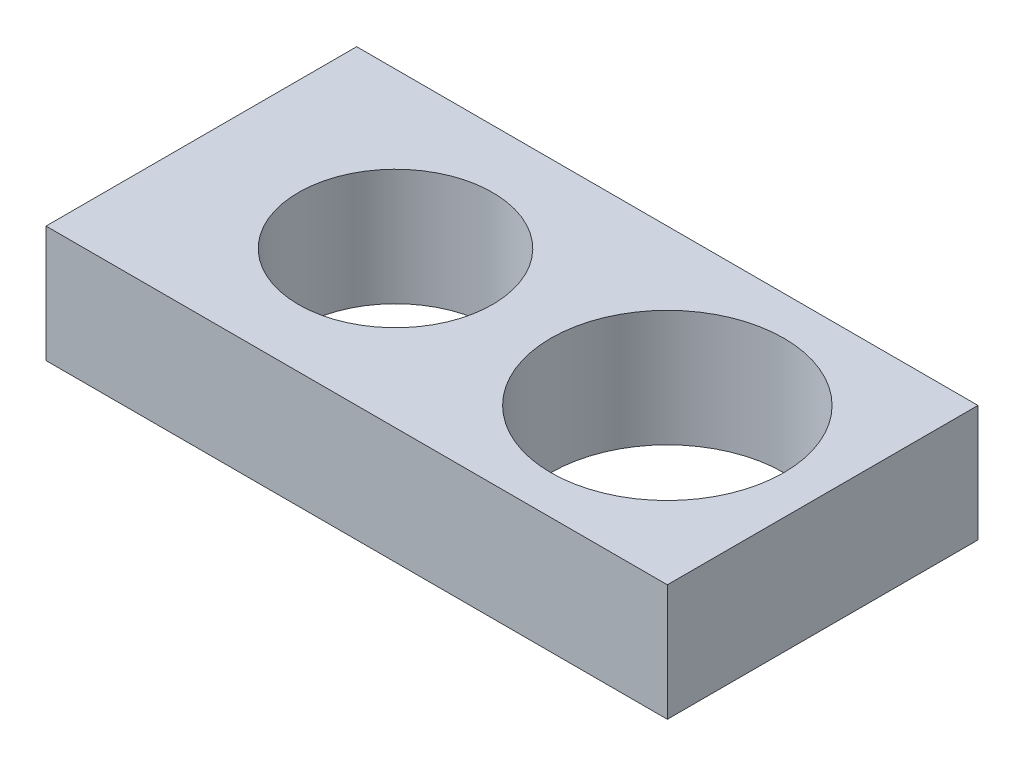
ISO-10303-21;
HEADER;
FILE_DESCRIPTION(('STEP AP214'),'2;1');
FILE_NAME('part.step','',(''),(''),'','','');
FILE_SCHEMA(('AUTOMOTIVE_DESIGN { 1 0 10303 214 1 1 1 1 }'));
ENDSEC;
DATA;
#1=APPLICATION_CONTEXT('core data for automotive mechanical design processes');
#2=APPLICATION_PROTOCOL_DEFINITION('international standard','automotive_design',2000,#1);
#3=PRODUCT_CONTEXT('',#1,'mechanical');
#4=PRODUCT('Part','Part','',(#3));
#5=PRODUCT_RELATED_PRODUCT_CATEGORY('part','',(#4));
#6=PRODUCT_DEFINITION_FORMATION('','',#4);
#7=PRODUCT_DEFINITION_CONTEXT('part definition',#1,'design');
#8=PRODUCT_DEFINITION('design','',#6,#7);
#9=PRODUCT_DEFINITION_SHAPE('','',#8);
#10=(LENGTH_UNIT() NAMED_UNIT(*) SI_UNIT(.MILLI.,.METRE.));
#11=(NAMED_UNIT(*) PLANE_ANGLE_UNIT() SI_UNIT($,.RADIAN.));
#12=(NAMED_UNIT(*) SI_UNIT($,.STERADIAN.) SOLID_ANGLE_UNIT());
#13=UNCERTAINTY_MEASURE_WITH_UNIT(LENGTH_MEASURE(1.E-05),#10,'distance_accuracy_value','');
#14=(GEOMETRIC_REPRESENTATION_CONTEXT(3) GLOBAL_UNCERTAINTY_ASSIGNED_CONTEXT((#13)) GLOBAL_UNIT_ASSIGNED_CONTEXT((#10,
#11,#12)) REPRESENTATION_CONTEXT('',''));
#15=CARTESIAN_POINT('',(0.,0.,0.));
#16=DIRECTION('',(0.,0.,1.));
#17=DIRECTION('',(1.,0.,0.));
#18=AXIS2_PLACEMENT_3D('',#15,#16,#17);
#19=CARTESIAN_POINT('',(0.,15.,0.));
#20=DIRECTION('',(0.,-1.,0.));
#21=DIRECTION('',(0.,0.,-1.));
#22=AXIS2_PLACEMENT_3D('',#19,#20,#21);
#23=PLANE('',#22);
#24=DIRECTION('',(0.,0.,-1.));
#25=VECTOR('',#24,1.);
#26=CARTESIAN_POINT('',(40.,15.,20.));
#27=LINE('',#26,#25);
#28=CARTESIAN_POINT('',(40.,15.,20.));
#29=VERTEX_POINT('',#28);
#30=CARTESIAN_POINT('',(40.,15.,-20.));
#31=VERTEX_POINT('',#30);
#32=EDGE_CURVE('E96',#29,#31,#27,.T.);
#33=ORIENTED_EDGE('',*,*,#32,.T.);
#34=DIRECTION('',(-1.,0.,0.));
#35=VECTOR('',#34,1.);
#36=CARTESIAN_POINT('',(-40.,15.,-20.));
#37=LINE('',#36,#35);
#38=CARTESIAN_POINT('',(-40.,15.,-20.));
#39=VERTEX_POINT('',#38);
#40=EDGE_CURVE('E91',#31,#39,#37,.T.);
#41=ORIENTED_EDGE('',*,*,#40,.T.);
#42=DIRECTION('',(0.,0.,1.));
#43=VECTOR('',#42,1.);
#44=CARTESIAN_POINT('',(-40.,15.,20.));
#45=LINE('',#44,#43);
#46=CARTESIAN_POINT('',(-40.,15.,20.));
#47=VERTEX_POINT('',#46);
#48=EDGE_CURVE('E94',#39,#47,#45,.T.);
#49=ORIENTED_EDGE('',*,*,#48,.T.);
#50=DIRECTION('',(1.,0.,0.));
#51=VECTOR('',#50,1.);
#52=CARTESIAN_POINT('',(-40.,15.,20.));
#53=LINE('',#52,#51);
#54=EDGE_CURVE('E61',#47,#29,#53,.T.);
#55=ORIENTED_EDGE('',*,*,#54,.T.);
#56=EDGE_LOOP('',(#33,#41,#49,#55));
#57=FACE_BOUND('',#56,.T.);
#58=CARTESIAN_POINT('',(-15.,15.,0.));
#59=DIRECTION('',(0.,1.,0.));
#60=DIRECTION('',(0.,0.,1.));
#61=AXIS2_PLACEMENT_3D('',#58,#59,#60);
#62=CIRCLE('',#61,12.5);
#63=CARTESIAN_POINT('',(-15.,15.,12.5));
#64=VERTEX_POINT('',#63);
#65=EDGE_CURVE('E116',#64,#64,#62,.T.);
#66=ORIENTED_EDGE('',*,*,#65,.F.);
#67=EDGE_LOOP('',(#66));
#68=FACE_BOUND('',#67,.T.);
#69=CARTESIAN_POINT('',(20.,15.,0.));
#70=DIRECTION('',(0.,1.,0.));
#71=DIRECTION('',(0.,0.,1.));
#72=AXIS2_PLACEMENT_3D('',#69,#70,#71);
#73=CIRCLE('',#72,15.);
#74=CARTESIAN_POINT('',(20.,15.,15.));
#75=VERTEX_POINT('',#74);
#76=EDGE_CURVE('E138',#75,#75,#73,.T.);
#77=ORIENTED_EDGE('',*,*,#76,.F.);
#78=EDGE_LOOP('',(#77));
#79=FACE_BOUND('',#78,.T.);
#80=ADVANCED_FACE('F43',(#57,#68,#79),#23,.F.);
#81=CARTESIAN_POINT('',(0.,0.,0.));
#82=DIRECTION('',(0.,-1.,0.));
#83=DIRECTION('',(0.,0.,-1.));
#84=AXIS2_PLACEMENT_3D('',#81,#82,#83);
#85=PLANE('',#84);
#86=CARTESIAN_POINT('',(-15.,0.,0.));
#87=DIRECTION('',(0.,1.,0.));
#88=DIRECTION('',(0.,0.,1.));
#89=AXIS2_PLACEMENT_3D('',#86,#87,#88);
#90=CIRCLE('',#89,12.5);
#91=CARTESIAN_POINT('',(-15.,0.,12.5));
#92=VERTEX_POINT('',#91);
#93=EDGE_CURVE('E134',#92,#92,#90,.T.);
#94=ORIENTED_EDGE('',*,*,#93,.T.);
#95=EDGE_LOOP('',(#94));
#96=FACE_BOUND('',#95,.T.);
#97=DIRECTION('',(0.,0.,-1.));
#98=VECTOR('',#97,1.);
#99=CARTESIAN_POINT('',(40.,0.,20.));
#100=LINE('',#99,#98);
#101=CARTESIAN_POINT('',(40.,0.,20.));
#102=VERTEX_POINT('',#101);
#103=CARTESIAN_POINT('',(40.,0.,-20.));
#104=VERTEX_POINT('',#103);
#105=EDGE_CURVE('E112',#102,#104,#100,.T.);
#106=ORIENTED_EDGE('',*,*,#105,.F.);
#107=DIRECTION('',(1.,0.,0.));
#108=VECTOR('',#107,1.);
#109=CARTESIAN_POINT('',(-40.,0.,20.));
#110=LINE('',#109,#108);
#111=CARTESIAN_POINT('',(-40.,0.,20.));
#112=VERTEX_POINT('',#111);
#113=EDGE_CURVE('E84',#112,#102,#110,.T.);
#114=ORIENTED_EDGE('',*,*,#113,.F.);
#115=DIRECTION('',(0.,0.,1.));
#116=VECTOR('',#115,1.);
#117=CARTESIAN_POINT('',(-40.,0.,20.));
#118=LINE('',#117,#116);
#119=CARTESIAN_POINT('',(-40.,0.,-20.));
#120=VERTEX_POINT('',#119);
#121=EDGE_CURVE('E78',#120,#112,#118,.T.);
#122=ORIENTED_EDGE('',*,*,#121,.F.);
#123=DIRECTION('',(-1.,0.,0.));
#124=VECTOR('',#123,1.);
#125=CARTESIAN_POINT('',(-40.,0.,-20.));
#126=LINE('',#125,#124);
#127=EDGE_CURVE('E101',#104,#120,#126,.T.);
#128=ORIENTED_EDGE('',*,*,#127,.F.);
#129=EDGE_LOOP('',(#106,#114,#122,#128));
#130=FACE_BOUND('',#129,.T.);
#131=CARTESIAN_POINT('',(20.,0.,0.));
#132=DIRECTION('',(0.,1.,0.));
#133=DIRECTION('',(0.,0.,1.));
#134=AXIS2_PLACEMENT_3D('',#131,#132,#133);
#135=CIRCLE('',#134,15.);
#136=CARTESIAN_POINT('',(20.,0.,15.));
#137=VERTEX_POINT('',#136);
#138=EDGE_CURVE('E142',#137,#137,#135,.T.);
#139=ORIENTED_EDGE('',*,*,#138,.T.);
#140=EDGE_LOOP('',(#139));
#141=FACE_BOUND('',#140,.T.);
#142=ADVANCED_FACE('F129',(#96,#130,#141),#85,.T.);
#143=CARTESIAN_POINT('',(40.,15.,20.));
#144=DIRECTION('',(-1.,0.,0.));
#145=DIRECTION('',(0.,0.,1.));
#146=AXIS2_PLACEMENT_3D('',#143,#144,#145);
#147=PLANE('',#146);
#148=ORIENTED_EDGE('',*,*,#105,.T.);
#149=DIRECTION('',(0.,-1.,0.));
#150=VECTOR('',#149,1.);
#151=CARTESIAN_POINT('',(40.,15.,-20.));
#152=LINE('',#151,#150);
#153=EDGE_CURVE('E11',#31,#104,#152,.T.);
#154=ORIENTED_EDGE('',*,*,#153,.F.);
#155=ORIENTED_EDGE('',*,*,#32,.F.);
#156=DIRECTION('',(0.,-1.,0.));
#157=VECTOR('',#156,1.);
#158=CARTESIAN_POINT('',(40.,15.,20.));
#159=LINE('',#158,#157);
#160=EDGE_CURVE('E108',#29,#102,#159,.T.);
#161=ORIENTED_EDGE('',*,*,#160,.T.);
#162=EDGE_LOOP('',(#148,#154,#155,#161));
#163=FACE_BOUND('',#162,.T.);
#164=ADVANCED_FACE('F45',(#163),#147,.F.);
#165=CARTESIAN_POINT('',(-40.,15.,-20.));
#166=DIRECTION('',(0.,0.,1.));
#167=DIRECTION('',(1.,0.,0.));
#168=AXIS2_PLACEMENT_3D('',#165,#166,#167);
#169=PLANE('',#168);
#170=ORIENTED_EDGE('',*,*,#127,.T.);
#171=DIRECTION('',(0.,-1.,0.));
#172=VECTOR('',#171,1.);
#173=CARTESIAN_POINT('',(-40.,15.,-20.));
#174=LINE('',#173,#172);
#175=EDGE_CURVE('E53',#39,#120,#174,.T.);
#176=ORIENTED_EDGE('',*,*,#175,.F.);
#177=ORIENTED_EDGE('',*,*,#40,.F.);
#178=ORIENTED_EDGE('',*,*,#153,.T.);
#179=EDGE_LOOP('',(#170,#176,#177,#178));
#180=FACE_BOUND('',#179,.T.);
#181=ADVANCED_FACE('F100',(#180),#169,.F.);
#182=CARTESIAN_POINT('',(-40.,15.,20.));
#183=DIRECTION('',(1.,0.,0.));
#184=DIRECTION('',(0.,0.,-1.));
#185=AXIS2_PLACEMENT_3D('',#182,#183,#184);
#186=PLANE('',#185);
#187=ORIENTED_EDGE('',*,*,#121,.T.);
#188=DIRECTION('',(0.,-1.,0.));
#189=VECTOR('',#188,1.);
#190=CARTESIAN_POINT('',(-40.,15.,20.));
#191=LINE('',#190,#189);
#192=EDGE_CURVE('E103',#47,#112,#191,.T.);
#193=ORIENTED_EDGE('',*,*,#192,.F.);
#194=ORIENTED_EDGE('',*,*,#48,.F.);
#195=ORIENTED_EDGE('',*,*,#175,.T.);
#196=EDGE_LOOP('',(#187,#193,#194,#195));
#197=FACE_BOUND('',#196,.T.);
#198=ADVANCED_FACE('F104',(#197),#186,.F.);
#199=CARTESIAN_POINT('',(-40.,15.,20.));
#200=DIRECTION('',(0.,0.,-1.));
#201=DIRECTION('',(-1.,0.,0.));
#202=AXIS2_PLACEMENT_3D('',#199,#200,#201);
#203=PLANE('',#202);
#204=ORIENTED_EDGE('',*,*,#113,.T.);
#205=ORIENTED_EDGE('',*,*,#160,.F.);
#206=ORIENTED_EDGE('',*,*,#54,.F.);
#207=ORIENTED_EDGE('',*,*,#192,.T.);
#208=EDGE_LOOP('',(#204,#205,#206,#207));
#209=FACE_BOUND('',#208,.T.);
#210=ADVANCED_FACE('F126',(#209),#203,.F.);
#211=CARTESIAN_POINT('',(-15.,15.,0.));
#212=DIRECTION('',(0.,-1.,0.));
#213=DIRECTION('',(0.,0.,-1.));
#214=AXIS2_PLACEMENT_3D('',#211,#212,#213);
#215=CYLINDRICAL_SURFACE('',#214,12.5);
#216=ORIENTED_EDGE('',*,*,#65,.T.);
#217=EDGE_LOOP('',(#216));
#218=FACE_BOUND('',#217,.T.);
#219=ORIENTED_EDGE('',*,*,#93,.F.);
#220=EDGE_LOOP('',(#219));
#221=FACE_BOUND('',#220,.T.);
#222=ADVANCED_FACE('F161',(#218,#221),#215,.F.);
#223=CARTESIAN_POINT('',(20.,15.,0.));
#224=DIRECTION('',(0.,-1.,0.));
#225=DIRECTION('',(0.,0.,-1.));
#226=AXIS2_PLACEMENT_3D('',#223,#224,#225);
#227=CYLINDRICAL_SURFACE('',#226,15.);
#228=ORIENTED_EDGE('',*,*,#76,.T.);
#229=EDGE_LOOP('',(#228));
#230=FACE_BOUND('',#229,.T.);
#231=ORIENTED_EDGE('',*,*,#138,.F.);
#232=EDGE_LOOP('',(#231));
#233=FACE_BOUND('',#232,.T.);
#234=ADVANCED_FACE('F150',(#230,#233),#227,.F.);
#235=CLOSED_SHELL('',(#80,#142,#164,#181,#198,#210,#222,#234));
#236=MANIFOLD_SOLID_BREP('B2',#235);
#237=ADVANCED_BREP_SHAPE_REPRESENTATION('',(#18,#236),#14);
#238=SHAPE_DEFINITION_REPRESENTATION(#9,#237);
ENDSEC;
END-ISO-10303-21;
